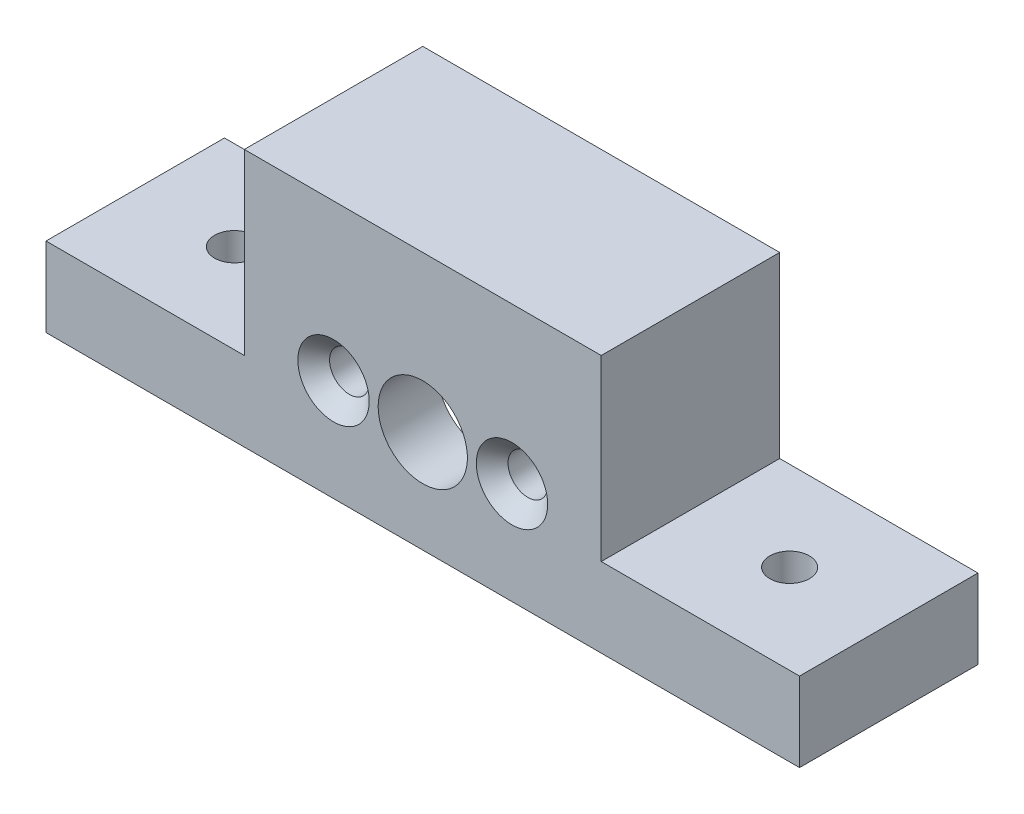
ISO-10303-21;
HEADER;
FILE_DESCRIPTION(('STEP AP214'),'2;1');
FILE_NAME('part.step','',(''),(''),'','','');
FILE_SCHEMA(('AUTOMOTIVE_DESIGN { 1 0 10303 214 1 1 1 1 }'));
ENDSEC;
DATA;
#1=APPLICATION_CONTEXT('core data for automotive mechanical design processes');
#2=APPLICATION_PROTOCOL_DEFINITION('international standard','automotive_design',2000,#1);
#3=PRODUCT_CONTEXT('',#1,'mechanical');
#4=PRODUCT('Part','Part','',(#3));
#5=PRODUCT_RELATED_PRODUCT_CATEGORY('part','',(#4));
#6=PRODUCT_DEFINITION_FORMATION('','',#4);
#7=PRODUCT_DEFINITION_CONTEXT('part definition',#1,'design');
#8=PRODUCT_DEFINITION('design','',#6,#7);
#9=PRODUCT_DEFINITION_SHAPE('','',#8);
#10=(LENGTH_UNIT() NAMED_UNIT(*) SI_UNIT(.MILLI.,.METRE.));
#11=(NAMED_UNIT(*) PLANE_ANGLE_UNIT() SI_UNIT($,.RADIAN.));
#12=(NAMED_UNIT(*) SI_UNIT($,.STERADIAN.) SOLID_ANGLE_UNIT());
#13=UNCERTAINTY_MEASURE_WITH_UNIT(LENGTH_MEASURE(1.E-05),#10,'distance_accuracy_value','');
#14=(GEOMETRIC_REPRESENTATION_CONTEXT(3) GLOBAL_UNCERTAINTY_ASSIGNED_CONTEXT((#13)) GLOBAL_UNIT_ASSIGNED_CONTEXT((#10,
#11,#12)) REPRESENTATION_CONTEXT('',''));
#15=CARTESIAN_POINT('',(0.,0.,0.));
#16=DIRECTION('',(0.,0.,1.));
#17=DIRECTION('',(1.,0.,0.));
#18=AXIS2_PLACEMENT_3D('',#15,#16,#17);
#19=CARTESIAN_POINT('',(9.,-6.5,9.));
#20=DIRECTION('',(-1.,0.,0.));
#21=DIRECTION('',(0.,0.,1.));
#22=AXIS2_PLACEMENT_3D('',#19,#20,#21);
#23=PLANE('',#22);
#24=DIRECTION('',(0.,0.,1.));
#25=VECTOR('',#24,1.);
#26=CARTESIAN_POINT('',(9.,-2.5,9.));
#27=LINE('',#26,#25);
#28=CARTESIAN_POINT('',(9.,-2.5,0.));
#29=VERTEX_POINT('',#28);
#30=CARTESIAN_POINT('',(9.,-2.5,9.));
#31=VERTEX_POINT('',#30);
#32=EDGE_CURVE('E62',#29,#31,#27,.T.);
#33=ORIENTED_EDGE('',*,*,#32,.F.);
#34=DIRECTION('',(0.,1.,0.));
#35=VECTOR('',#34,1.);
#36=CARTESIAN_POINT('',(9.,-6.5,0.));
#37=LINE('',#36,#35);
#38=CARTESIAN_POINT('',(9.,6.5,0.));
#39=VERTEX_POINT('',#38);
#40=EDGE_CURVE('E191',#29,#39,#37,.T.);
#41=ORIENTED_EDGE('',*,*,#40,.T.);
#42=DIRECTION('',(0.,0.,-1.));
#43=VECTOR('',#42,1.);
#44=CARTESIAN_POINT('',(9.,6.5,9.));
#45=LINE('',#44,#43);
#46=CARTESIAN_POINT('',(9.,6.5,9.));
#47=VERTEX_POINT('',#46);
#48=EDGE_CURVE('E11',#47,#39,#45,.T.);
#49=ORIENTED_EDGE('',*,*,#48,.F.);
#50=DIRECTION('',(0.,1.,0.));
#51=VECTOR('',#50,1.);
#52=CARTESIAN_POINT('',(9.,-6.5,9.));
#53=LINE('',#52,#51);
#54=EDGE_CURVE('E201',#31,#47,#53,.T.);
#55=ORIENTED_EDGE('',*,*,#54,.F.);
#56=EDGE_LOOP('',(#33,#41,#49,#55));
#57=FACE_BOUND('',#56,.T.);
#58=ADVANCED_FACE('F37',(#57),#23,.F.);
#59=CARTESIAN_POINT('',(-9.,-6.5,9.));
#60=DIRECTION('',(1.,0.,0.));
#61=DIRECTION('',(0.,0.,-1.));
#62=AXIS2_PLACEMENT_3D('',#59,#60,#61);
#63=PLANE('',#62);
#64=DIRECTION('',(0.,-1.,0.));
#65=VECTOR('',#64,1.);
#66=CARTESIAN_POINT('',(-9.,-6.5,0.));
#67=LINE('',#66,#65);
#68=CARTESIAN_POINT('',(-9.,6.5,0.));
#69=VERTEX_POINT('',#68);
#70=CARTESIAN_POINT('',(-9.,-2.5,0.));
#71=VERTEX_POINT('',#70);
#72=EDGE_CURVE('E171',#69,#71,#67,.T.);
#73=ORIENTED_EDGE('',*,*,#72,.T.);
#74=DIRECTION('',(0.,0.,1.));
#75=VECTOR('',#74,1.);
#76=CARTESIAN_POINT('',(-9.,-2.5,9.));
#77=LINE('',#76,#75);
#78=CARTESIAN_POINT('',(-9.,-2.5,9.));
#79=VERTEX_POINT('',#78);
#80=EDGE_CURVE('E146',#71,#79,#77,.T.);
#81=ORIENTED_EDGE('',*,*,#80,.T.);
#82=DIRECTION('',(0.,-1.,0.));
#83=VECTOR('',#82,1.);
#84=CARTESIAN_POINT('',(-9.,-6.5,9.));
#85=LINE('',#84,#83);
#86=CARTESIAN_POINT('',(-9.,6.5,9.));
#87=VERTEX_POINT('',#86);
#88=EDGE_CURVE('E134',#87,#79,#85,.T.);
#89=ORIENTED_EDGE('',*,*,#88,.F.);
#90=DIRECTION('',(0.,0.,-1.));
#91=VECTOR('',#90,1.);
#92=CARTESIAN_POINT('',(-9.,6.5,9.));
#93=LINE('',#92,#91);
#94=EDGE_CURVE('E46',#87,#69,#93,.T.);
#95=ORIENTED_EDGE('',*,*,#94,.T.);
#96=EDGE_LOOP('',(#73,#81,#89,#95));
#97=FACE_BOUND('',#96,.T.);
#98=ADVANCED_FACE('F39',(#97),#63,.F.);
#99=CARTESIAN_POINT('',(9.,-6.5,9.));
#100=DIRECTION('',(0.,1.,0.));
#101=DIRECTION('',(-1.,0.,0.));
#102=AXIS2_PLACEMENT_3D('',#99,#100,#101);
#103=PLANE('',#102);
#104=CARTESIAN_POINT('',(-14.,-6.5,4.5));
#105=DIRECTION('',(0.,1.,0.));
#106=DIRECTION('',(0.,0.,1.));
#107=AXIS2_PLACEMENT_3D('',#104,#105,#106);
#108=CIRCLE('',#107,0.999999999999999);
#109=CARTESIAN_POINT('',(-14.,-6.5,5.5));
#110=VERTEX_POINT('',#109);
#111=EDGE_CURVE('E160',#110,#110,#108,.T.);
#112=ORIENTED_EDGE('',*,*,#111,.T.);
#113=EDGE_LOOP('',(#112));
#114=FACE_BOUND('',#113,.T.);
#115=CARTESIAN_POINT('',(14.,-6.5,4.5));
#116=DIRECTION('',(0.,1.,0.));
#117=DIRECTION('',(0.,0.,1.));
#118=AXIS2_PLACEMENT_3D('',#115,#116,#117);
#119=CIRCLE('',#118,0.999999999999999);
#120=CARTESIAN_POINT('',(14.,-6.5,5.5));
#121=VERTEX_POINT('',#120);
#122=EDGE_CURVE('E267',#121,#121,#119,.T.);
#123=ORIENTED_EDGE('',*,*,#122,.T.);
#124=EDGE_LOOP('',(#123));
#125=FACE_BOUND('',#124,.T.);
#126=DIRECTION('',(-1.,0.,0.));
#127=VECTOR('',#126,1.);
#128=CARTESIAN_POINT('',(6.3,-6.5,6.));
#129=LINE('',#128,#127);
#130=CARTESIAN_POINT('',(6.3,-6.5,6.));
#131=VERTEX_POINT('',#130);
#132=CARTESIAN_POINT('',(-6.3,-6.5,6.));
#133=VERTEX_POINT('',#132);
#134=EDGE_CURVE('E232',#131,#133,#129,.T.);
#135=ORIENTED_EDGE('',*,*,#134,.F.);
#136=DIRECTION('',(0.,0.,-1.));
#137=VECTOR('',#136,1.);
#138=CARTESIAN_POINT('',(6.3,-6.5,6.));
#139=LINE('',#138,#137);
#140=CARTESIAN_POINT('',(6.3,-6.5,0.));
#141=VERTEX_POINT('',#140);
#142=EDGE_CURVE('E210',#131,#141,#139,.T.);
#143=ORIENTED_EDGE('',*,*,#142,.T.);
#144=DIRECTION('',(1.,0.,0.));
#145=VECTOR('',#144,1.);
#146=CARTESIAN_POINT('',(9.,-6.5,0.));
#147=LINE('',#146,#145);
#148=CARTESIAN_POINT('',(19.,-6.5,0.));
#149=VERTEX_POINT('',#148);
#150=EDGE_CURVE('E175',#141,#149,#147,.T.);
#151=ORIENTED_EDGE('',*,*,#150,.T.);
#152=DIRECTION('',(0.,0.,-1.));
#153=VECTOR('',#152,1.);
#154=CARTESIAN_POINT('',(19.,-6.5,9.));
#155=LINE('',#154,#153);
#156=CARTESIAN_POINT('',(19.,-6.5,9.));
#157=VERTEX_POINT('',#156);
#158=EDGE_CURVE('E262',#157,#149,#155,.T.);
#159=ORIENTED_EDGE('',*,*,#158,.F.);
#160=DIRECTION('',(1.,0.,0.));
#161=VECTOR('',#160,1.);
#162=CARTESIAN_POINT('',(9.,-6.5,9.));
#163=LINE('',#162,#161);
#164=CARTESIAN_POINT('',(-19.,-6.5,9.));
#165=VERTEX_POINT('',#164);
#166=EDGE_CURVE('E203',#165,#157,#163,.T.);
#167=ORIENTED_EDGE('',*,*,#166,.F.);
#168=DIRECTION('',(0.,0.,-1.));
#169=VECTOR('',#168,1.);
#170=CARTESIAN_POINT('',(-19.,-6.5,9.));
#171=LINE('',#170,#169);
#172=CARTESIAN_POINT('',(-19.,-6.5,0.));
#173=VERTEX_POINT('',#172);
#174=EDGE_CURVE('E145',#165,#173,#171,.T.);
#175=ORIENTED_EDGE('',*,*,#174,.T.);
#176=CARTESIAN_POINT('',(-6.3,-6.5,0.));
#177=VERTEX_POINT('',#176);
#178=EDGE_CURVE('E177',#173,#177,#147,.T.);
#179=ORIENTED_EDGE('',*,*,#178,.T.);
#180=DIRECTION('',(0.,0.,-1.));
#181=VECTOR('',#180,1.);
#182=CARTESIAN_POINT('',(-6.3,-6.5,6.));
#183=LINE('',#182,#181);
#184=EDGE_CURVE('E213',#133,#177,#183,.T.);
#185=ORIENTED_EDGE('',*,*,#184,.F.);
#186=EDGE_LOOP('',(#135,#143,#151,#159,#167,#175,#179,#185));
#187=FACE_BOUND('',#186,.T.);
#188=ADVANCED_FACE('F325',(#114,#125,#187),#103,.F.);
#189=CARTESIAN_POINT('',(9.,6.5,9.));
#190=DIRECTION('',(0.,-1.,0.));
#191=DIRECTION('',(1.,0.,0.));
#192=AXIS2_PLACEMENT_3D('',#189,#190,#191);
#193=PLANE('',#192);
#194=DIRECTION('',(-1.,0.,0.));
#195=VECTOR('',#194,1.);
#196=CARTESIAN_POINT('',(9.,6.5,0.));
#197=LINE('',#196,#195);
#198=EDGE_CURVE('E194',#39,#69,#197,.T.);
#199=ORIENTED_EDGE('',*,*,#198,.T.);
#200=ORIENTED_EDGE('',*,*,#94,.F.);
#201=DIRECTION('',(-1.,0.,0.));
#202=VECTOR('',#201,1.);
#203=CARTESIAN_POINT('',(9.,6.5,9.));
#204=LINE('',#203,#202);
#205=EDGE_CURVE('E187',#47,#87,#204,.T.);
#206=ORIENTED_EDGE('',*,*,#205,.F.);
#207=ORIENTED_EDGE('',*,*,#48,.T.);
#208=EDGE_LOOP('',(#199,#200,#206,#207));
#209=FACE_BOUND('',#208,.T.);
#210=ADVANCED_FACE('F296',(#209),#193,.F.);
#211=CARTESIAN_POINT('',(0.,0.,9.));
#212=DIRECTION('',(0.,0.,1.));
#213=DIRECTION('',(1.,0.,0.));
#214=AXIS2_PLACEMENT_3D('',#211,#212,#213);
#215=PLANE('',#214);
#216=CARTESIAN_POINT('',(-4.5,-1.35,9.));
#217=DIRECTION('',(0.,0.,1.));
#218=DIRECTION('',(1.,0.,0.));
#219=AXIS2_PLACEMENT_3D('',#216,#217,#218);
#220=CIRCLE('',#219,1.8);
#221=CARTESIAN_POINT('',(-2.7,-1.35,9.));
#222=VERTEX_POINT('',#221);
#223=EDGE_CURVE('E252',#222,#222,#220,.T.);
#224=ORIENTED_EDGE('',*,*,#223,.F.);
#225=EDGE_LOOP('',(#224));
#226=FACE_BOUND('',#225,.T.);
#227=CARTESIAN_POINT('',(4.5,-1.35,9.));
#228=DIRECTION('',(0.,0.,1.));
#229=DIRECTION('',(1.,0.,0.));
#230=AXIS2_PLACEMENT_3D('',#227,#228,#229);
#231=CIRCLE('',#230,1.8);
#232=CARTESIAN_POINT('',(6.3,-1.35,9.));
#233=VERTEX_POINT('',#232);
#234=EDGE_CURVE('E246',#233,#233,#231,.T.);
#235=ORIENTED_EDGE('',*,*,#234,.F.);
#236=EDGE_LOOP('',(#235));
#237=FACE_BOUND('',#236,.T.);
#238=CARTESIAN_POINT('',(0.,-1.35,9.));
#239=DIRECTION('',(0.,0.,-1.));
#240=DIRECTION('',(-1.,0.,0.));
#241=AXIS2_PLACEMENT_3D('',#238,#239,#240);
#242=CIRCLE('',#241,2.25);
#243=CARTESIAN_POINT('',(-2.25,-1.35,9.));
#244=VERTEX_POINT('',#243);
#245=EDGE_CURVE('E226',#244,#244,#242,.T.);
#246=ORIENTED_EDGE('',*,*,#245,.T.);
#247=EDGE_LOOP('',(#246));
#248=FACE_BOUND('',#247,.T.);
#249=ORIENTED_EDGE('',*,*,#88,.T.);
#250=DIRECTION('',(1.,0.,0.));
#251=VECTOR('',#250,1.);
#252=CARTESIAN_POINT('',(-19.,-2.5,9.));
#253=LINE('',#252,#251);
#254=CARTESIAN_POINT('',(-19.,-2.5,9.));
#255=VERTEX_POINT('',#254);
#256=EDGE_CURVE('E54',#255,#79,#253,.T.);
#257=ORIENTED_EDGE('',*,*,#256,.F.);
#258=DIRECTION('',(0.,-1.,0.));
#259=VECTOR('',#258,1.);
#260=CARTESIAN_POINT('',(-19.,-6.5,9.));
#261=LINE('',#260,#259);
#262=EDGE_CURVE('E131',#255,#165,#261,.T.);
#263=ORIENTED_EDGE('',*,*,#262,.T.);
#264=ORIENTED_EDGE('',*,*,#166,.T.);
#265=DIRECTION('',(0.,-1.,0.));
#266=VECTOR('',#265,1.);
#267=CARTESIAN_POINT('',(19.,-6.5,9.));
#268=LINE('',#267,#266);
#269=CARTESIAN_POINT('',(19.,-2.5,9.));
#270=VERTEX_POINT('',#269);
#271=EDGE_CURVE('E265',#270,#157,#268,.T.);
#272=ORIENTED_EDGE('',*,*,#271,.F.);
#273=DIRECTION('',(-1.,0.,0.));
#274=VECTOR('',#273,1.);
#275=CARTESIAN_POINT('',(19.,-2.5,9.));
#276=LINE('',#275,#274);
#277=EDGE_CURVE('E259',#270,#31,#276,.T.);
#278=ORIENTED_EDGE('',*,*,#277,.T.);
#279=ORIENTED_EDGE('',*,*,#54,.T.);
#280=ORIENTED_EDGE('',*,*,#205,.T.);
#281=EDGE_LOOP('',(#249,#257,#263,#264,#272,#278,#279,#280));
#282=FACE_BOUND('',#281,.T.);
#283=ADVANCED_FACE('F130',(#226,#237,#248,#282),#215,.T.);
#284=CARTESIAN_POINT('',(0.,0.,0.));
#285=DIRECTION('',(0.,0.,1.));
#286=DIRECTION('',(1.,0.,0.));
#287=AXIS2_PLACEMENT_3D('',#284,#285,#286);
#288=PLANE('',#287);
#289=ORIENTED_EDGE('',*,*,#150,.F.);
#290=DIRECTION('',(0.,-1.,0.));
#291=VECTOR('',#290,1.);
#292=CARTESIAN_POINT('',(6.3,-6.5,0.));
#293=LINE('',#292,#291);
#294=CARTESIAN_POINT('',(6.3,3.8,0.));
#295=VERTEX_POINT('',#294);
#296=EDGE_CURVE('E224',#295,#141,#293,.T.);
#297=ORIENTED_EDGE('',*,*,#296,.F.);
#298=DIRECTION('',(1.,0.,0.));
#299=VECTOR('',#298,1.);
#300=CARTESIAN_POINT('',(6.3,3.8,0.));
#301=LINE('',#300,#299);
#302=CARTESIAN_POINT('',(-6.3,3.8,0.));
#303=VERTEX_POINT('',#302);
#304=EDGE_CURVE('E217',#303,#295,#301,.T.);
#305=ORIENTED_EDGE('',*,*,#304,.F.);
#306=DIRECTION('',(0.,1.,0.));
#307=VECTOR('',#306,1.);
#308=CARTESIAN_POINT('',(-6.3,-6.5,0.));
#309=LINE('',#308,#307);
#310=EDGE_CURVE('E221',#177,#303,#309,.T.);
#311=ORIENTED_EDGE('',*,*,#310,.F.);
#312=ORIENTED_EDGE('',*,*,#178,.F.);
#313=DIRECTION('',(0.,1.,0.));
#314=VECTOR('',#313,1.);
#315=CARTESIAN_POINT('',(-19.,-6.5,0.));
#316=LINE('',#315,#314);
#317=CARTESIAN_POINT('',(-19.,-2.5,0.));
#318=VERTEX_POINT('',#317);
#319=EDGE_CURVE('E149',#173,#318,#316,.T.);
#320=ORIENTED_EDGE('',*,*,#319,.T.);
#321=DIRECTION('',(1.,0.,0.));
#322=VECTOR('',#321,1.);
#323=CARTESIAN_POINT('',(-19.,-2.5,0.));
#324=LINE('',#323,#322);
#325=EDGE_CURVE('E136',#318,#71,#324,.T.);
#326=ORIENTED_EDGE('',*,*,#325,.T.);
#327=ORIENTED_EDGE('',*,*,#72,.F.);
#328=ORIENTED_EDGE('',*,*,#198,.F.);
#329=ORIENTED_EDGE('',*,*,#40,.F.);
#330=DIRECTION('',(-1.,0.,0.));
#331=VECTOR('',#330,1.);
#332=CARTESIAN_POINT('',(19.,-2.5,0.));
#333=LINE('',#332,#331);
#334=CARTESIAN_POINT('',(19.,-2.5,0.));
#335=VERTEX_POINT('',#334);
#336=EDGE_CURVE('E254',#335,#29,#333,.T.);
#337=ORIENTED_EDGE('',*,*,#336,.F.);
#338=DIRECTION('',(0.,1.,0.));
#339=VECTOR('',#338,1.);
#340=CARTESIAN_POINT('',(19.,-6.5,0.));
#341=LINE('',#340,#339);
#342=EDGE_CURVE('E260',#149,#335,#341,.T.);
#343=ORIENTED_EDGE('',*,*,#342,.F.);
#344=EDGE_LOOP('',(#289,#297,#305,#311,#312,#320,#326,#327,#328,#329,#337,#343));
#345=FACE_BOUND('',#344,.T.);
#346=ADVANCED_FACE('F168',(#345),#288,.F.);
#347=CARTESIAN_POINT('',(6.3,-6.5,6.));
#348=DIRECTION('',(1.,0.,0.));
#349=DIRECTION('',(0.,0.,-1.));
#350=AXIS2_PLACEMENT_3D('',#347,#348,#349);
#351=PLANE('',#350);
#352=ORIENTED_EDGE('',*,*,#296,.T.);
#353=ORIENTED_EDGE('',*,*,#142,.F.);
#354=DIRECTION('',(0.,-1.,0.));
#355=VECTOR('',#354,1.);
#356=CARTESIAN_POINT('',(6.3,-6.5,6.));
#357=LINE('',#356,#355);
#358=CARTESIAN_POINT('',(6.3,3.8,6.));
#359=VERTEX_POINT('',#358);
#360=EDGE_CURVE('E220',#359,#131,#357,.T.);
#361=ORIENTED_EDGE('',*,*,#360,.F.);
#362=DIRECTION('',(0.,0.,-1.));
#363=VECTOR('',#362,1.);
#364=CARTESIAN_POINT('',(6.3,3.8,6.));
#365=LINE('',#364,#363);
#366=EDGE_CURVE('E176',#359,#295,#365,.T.);
#367=ORIENTED_EDGE('',*,*,#366,.T.);
#368=EDGE_LOOP('',(#352,#353,#361,#367));
#369=FACE_BOUND('',#368,.T.);
#370=ADVANCED_FACE('F344',(#369),#351,.F.);
#371=CARTESIAN_POINT('',(6.3,3.8,6.));
#372=DIRECTION('',(0.,1.,0.));
#373=DIRECTION('',(0.,0.,1.));
#374=AXIS2_PLACEMENT_3D('',#371,#372,#373);
#375=PLANE('',#374);
#376=ORIENTED_EDGE('',*,*,#304,.T.);
#377=ORIENTED_EDGE('',*,*,#366,.F.);
#378=DIRECTION('',(1.,0.,0.));
#379=VECTOR('',#378,1.);
#380=CARTESIAN_POINT('',(6.3,3.8,6.));
#381=LINE('',#380,#379);
#382=CARTESIAN_POINT('',(-6.3,3.8,6.));
#383=VERTEX_POINT('',#382);
#384=EDGE_CURVE('E214',#383,#359,#381,.T.);
#385=ORIENTED_EDGE('',*,*,#384,.F.);
#386=DIRECTION('',(0.,0.,-1.));
#387=VECTOR('',#386,1.);
#388=CARTESIAN_POINT('',(-6.3,3.8,6.));
#389=LINE('',#388,#387);
#390=EDGE_CURVE('E179',#383,#303,#389,.T.);
#391=ORIENTED_EDGE('',*,*,#390,.T.);
#392=EDGE_LOOP('',(#376,#377,#385,#391));
#393=FACE_BOUND('',#392,.T.);
#394=ADVANCED_FACE('F351',(#393),#375,.F.);
#395=CARTESIAN_POINT('',(-6.3,-6.5,6.));
#396=DIRECTION('',(-1.,0.,0.));
#397=DIRECTION('',(0.,0.,1.));
#398=AXIS2_PLACEMENT_3D('',#395,#396,#397);
#399=PLANE('',#398);
#400=ORIENTED_EDGE('',*,*,#310,.T.);
#401=ORIENTED_EDGE('',*,*,#390,.F.);
#402=DIRECTION('',(0.,1.,0.));
#403=VECTOR('',#402,1.);
#404=CARTESIAN_POINT('',(-6.3,-6.5,6.));
#405=LINE('',#404,#403);
#406=EDGE_CURVE('E229',#133,#383,#405,.T.);
#407=ORIENTED_EDGE('',*,*,#406,.F.);
#408=ORIENTED_EDGE('',*,*,#184,.T.);
#409=EDGE_LOOP('',(#400,#401,#407,#408));
#410=FACE_BOUND('',#409,.T.);
#411=ADVANCED_FACE('F349',(#410),#399,.F.);
#412=CARTESIAN_POINT('',(0.,0.,6.));
#413=DIRECTION('',(0.,0.,1.));
#414=DIRECTION('',(1.,0.,0.));
#415=AXIS2_PLACEMENT_3D('',#412,#413,#414);
#416=PLANE('',#415);
#417=CARTESIAN_POINT('',(-4.5,-1.35,6.));
#418=DIRECTION('',(0.,0.,1.));
#419=DIRECTION('',(1.,0.,0.));
#420=AXIS2_PLACEMENT_3D('',#417,#418,#419);
#421=CIRCLE('',#420,0.999999999999992);
#422=CARTESIAN_POINT('',(-3.50000000000001,-1.35,6.));
#423=VERTEX_POINT('',#422);
#424=EDGE_CURVE('E199',#423,#423,#421,.T.);
#425=ORIENTED_EDGE('',*,*,#424,.T.);
#426=EDGE_LOOP('',(#425));
#427=FACE_BOUND('',#426,.T.);
#428=CARTESIAN_POINT('',(4.5,-1.35,6.));
#429=DIRECTION('',(0.,0.,1.));
#430=DIRECTION('',(1.,0.,0.));
#431=AXIS2_PLACEMENT_3D('',#428,#429,#430);
#432=CIRCLE('',#431,0.999999999999992);
#433=CARTESIAN_POINT('',(5.49999999999999,-1.35,6.));
#434=VERTEX_POINT('',#433);
#435=EDGE_CURVE('E240',#434,#434,#432,.T.);
#436=ORIENTED_EDGE('',*,*,#435,.T.);
#437=EDGE_LOOP('',(#436));
#438=FACE_BOUND('',#437,.T.);
#439=CARTESIAN_POINT('',(0.,-1.35,6.));
#440=DIRECTION('',(0.,0.,-1.));
#441=DIRECTION('',(-1.,0.,0.));
#442=AXIS2_PLACEMENT_3D('',#439,#440,#441);
#443=CIRCLE('',#442,2.25);
#444=CARTESIAN_POINT('',(-2.25,-1.35,6.));
#445=VERTEX_POINT('',#444);
#446=EDGE_CURVE('E237',#445,#445,#443,.T.);
#447=ORIENTED_EDGE('',*,*,#446,.F.);
#448=EDGE_LOOP('',(#447));
#449=FACE_BOUND('',#448,.T.);
#450=ORIENTED_EDGE('',*,*,#360,.T.);
#451=ORIENTED_EDGE('',*,*,#134,.T.);
#452=ORIENTED_EDGE('',*,*,#406,.T.);
#453=ORIENTED_EDGE('',*,*,#384,.T.);
#454=EDGE_LOOP('',(#450,#451,#452,#453));
#455=FACE_BOUND('',#454,.T.);
#456=ADVANCED_FACE('F300',(#427,#438,#449,#455),#416,.F.);
#457=CARTESIAN_POINT('',(0.,-1.35,9.));
#458=DIRECTION('',(0.,0.,-1.));
#459=DIRECTION('',(-1.,0.,0.));
#460=AXIS2_PLACEMENT_3D('',#457,#458,#459);
#461=CYLINDRICAL_SURFACE('',#460,2.25);
#462=ORIENTED_EDGE('',*,*,#245,.F.);
#463=EDGE_LOOP('',(#462));
#464=FACE_BOUND('',#463,.T.);
#465=ORIENTED_EDGE('',*,*,#446,.T.);
#466=EDGE_LOOP('',(#465));
#467=FACE_BOUND('',#466,.T.);
#468=ADVANCED_FACE('F306',(#464,#467),#461,.F.);
#469=CARTESIAN_POINT('',(4.5,-1.35,9.));
#470=DIRECTION('',(0.,0.,1.));
#471=DIRECTION('',(1.,0.,0.));
#472=AXIS2_PLACEMENT_3D('',#469,#470,#471);
#473=CYLINDRICAL_SURFACE('',#472,0.999999999999992);
#474=CARTESIAN_POINT('',(4.5,-1.35,8.19999999999999));
#475=DIRECTION('',(0.,0.,1.));
#476=DIRECTION('',(1.,0.,0.));
#477=AXIS2_PLACEMENT_3D('',#474,#475,#476);
#478=CIRCLE('',#477,0.999999999999987);
#479=CARTESIAN_POINT('',(5.49999999999999,-1.35,8.19999999999999));
#480=VERTEX_POINT('',#479);
#481=EDGE_CURVE('E243',#480,#480,#478,.T.);
#482=ORIENTED_EDGE('',*,*,#481,.T.);
#483=EDGE_LOOP('',(#482));
#484=FACE_BOUND('',#483,.T.);
#485=ORIENTED_EDGE('',*,*,#435,.F.);
#486=EDGE_LOOP('',(#485));
#487=FACE_BOUND('',#486,.T.);
#488=ADVANCED_FACE('F303',(#484,#487),#473,.F.);
#489=CARTESIAN_POINT('',(4.5,-1.35,9.));
#490=DIRECTION('',(0.,0.,1.));
#491=DIRECTION('',(1.,0.,0.));
#492=AXIS2_PLACEMENT_3D('',#489,#490,#491);
#493=CONICAL_SURFACE('',#492,1.8,0.785398163397449);
#494=ORIENTED_EDGE('',*,*,#481,.F.);
#495=EDGE_LOOP('',(#494));
#496=FACE_BOUND('',#495,.T.);
#497=ORIENTED_EDGE('',*,*,#234,.T.);
#498=EDGE_LOOP('',(#497));
#499=FACE_BOUND('',#498,.T.);
#500=ADVANCED_FACE('F305',(#496,#499),#493,.F.);
#501=CARTESIAN_POINT('',(-4.5,-1.35,9.));
#502=DIRECTION('',(0.,0.,1.));
#503=DIRECTION('',(1.,0.,0.));
#504=AXIS2_PLACEMENT_3D('',#501,#502,#503);
#505=CYLINDRICAL_SURFACE('',#504,0.999999999999992);
#506=CARTESIAN_POINT('',(-4.5,-1.35,8.19999999999999));
#507=DIRECTION('',(0.,0.,1.));
#508=DIRECTION('',(1.,0.,0.));
#509=AXIS2_PLACEMENT_3D('',#506,#507,#508);
#510=CIRCLE('',#509,0.999999999999987);
#511=CARTESIAN_POINT('',(-3.50000000000001,-1.35,8.19999999999999));
#512=VERTEX_POINT('',#511);
#513=EDGE_CURVE('E249',#512,#512,#510,.T.);
#514=ORIENTED_EDGE('',*,*,#513,.T.);
#515=EDGE_LOOP('',(#514));
#516=FACE_BOUND('',#515,.T.);
#517=ORIENTED_EDGE('',*,*,#424,.F.);
#518=EDGE_LOOP('',(#517));
#519=FACE_BOUND('',#518,.T.);
#520=ADVANCED_FACE('F313',(#516,#519),#505,.F.);
#521=CARTESIAN_POINT('',(-4.5,-1.35,9.));
#522=DIRECTION('',(0.,0.,1.));
#523=DIRECTION('',(1.,0.,0.));
#524=AXIS2_PLACEMENT_3D('',#521,#522,#523);
#525=CONICAL_SURFACE('',#524,1.8,0.785398163397449);
#526=ORIENTED_EDGE('',*,*,#513,.F.);
#527=EDGE_LOOP('',(#526));
#528=FACE_BOUND('',#527,.T.);
#529=ORIENTED_EDGE('',*,*,#223,.T.);
#530=EDGE_LOOP('',(#529));
#531=FACE_BOUND('',#530,.T.);
#532=ADVANCED_FACE('F280',(#528,#531),#525,.F.);
#533=CARTESIAN_POINT('',(19.,-2.5,9.));
#534=DIRECTION('',(0.,-1.,0.));
#535=DIRECTION('',(0.,0.,-1.));
#536=AXIS2_PLACEMENT_3D('',#533,#534,#535);
#537=PLANE('',#536);
#538=CARTESIAN_POINT('',(14.,-2.5,4.5));
#539=DIRECTION('',(0.,1.,0.));
#540=DIRECTION('',(0.,0.,1.));
#541=AXIS2_PLACEMENT_3D('',#538,#539,#540);
#542=CIRCLE('',#541,0.999999999999987);
#543=CARTESIAN_POINT('',(14.,-2.5,5.49999999999999));
#544=VERTEX_POINT('',#543);
#545=EDGE_CURVE('E135',#544,#544,#542,.T.);
#546=ORIENTED_EDGE('',*,*,#545,.F.);
#547=EDGE_LOOP('',(#546));
#548=FACE_BOUND('',#547,.T.);
#549=ORIENTED_EDGE('',*,*,#32,.T.);
#550=ORIENTED_EDGE('',*,*,#277,.F.);
#551=DIRECTION('',(0.,0.,1.));
#552=VECTOR('',#551,1.);
#553=CARTESIAN_POINT('',(19.,-2.5,9.));
#554=LINE('',#553,#552);
#555=EDGE_CURVE('E257',#335,#270,#554,.T.);
#556=ORIENTED_EDGE('',*,*,#555,.F.);
#557=ORIENTED_EDGE('',*,*,#336,.T.);
#558=EDGE_LOOP('',(#549,#550,#556,#557));
#559=FACE_BOUND('',#558,.T.);
#560=ADVANCED_FACE('F276',(#548,#559),#537,.F.);
#561=CARTESIAN_POINT('',(19.,0.,0.));
#562=DIRECTION('',(-1.,0.,0.));
#563=DIRECTION('',(0.,0.,1.));
#564=AXIS2_PLACEMENT_3D('',#561,#562,#563);
#565=PLANE('',#564);
#566=ORIENTED_EDGE('',*,*,#271,.T.);
#567=ORIENTED_EDGE('',*,*,#158,.T.);
#568=ORIENTED_EDGE('',*,*,#342,.T.);
#569=ORIENTED_EDGE('',*,*,#555,.T.);
#570=EDGE_LOOP('',(#566,#567,#568,#569));
#571=FACE_BOUND('',#570,.T.);
#572=ADVANCED_FACE('F279',(#571),#565,.F.);
#573=CARTESIAN_POINT('',(14.,-2.5,4.5));
#574=DIRECTION('',(0.,1.,0.));
#575=DIRECTION('',(0.,0.,1.));
#576=AXIS2_PLACEMENT_3D('',#573,#574,#575);
#577=CYLINDRICAL_SURFACE('',#576,0.999999999999993);
#578=ORIENTED_EDGE('',*,*,#122,.F.);
#579=EDGE_LOOP('',(#578));
#580=FACE_BOUND('',#579,.T.);
#581=ORIENTED_EDGE('',*,*,#545,.T.);
#582=EDGE_LOOP('',(#581));
#583=FACE_BOUND('',#582,.T.);
#584=ADVANCED_FACE('F274',(#580,#583),#577,.F.);
#585=CARTESIAN_POINT('',(-19.,-2.5,9.));
#586=DIRECTION('',(0.,1.,0.));
#587=DIRECTION('',(0.,0.,1.));
#588=AXIS2_PLACEMENT_3D('',#585,#586,#587);
#589=PLANE('',#588);
#590=CARTESIAN_POINT('',(-14.,-2.5,4.5));
#591=DIRECTION('',(0.,1.,0.));
#592=DIRECTION('',(0.,0.,1.));
#593=AXIS2_PLACEMENT_3D('',#590,#591,#592);
#594=CIRCLE('',#593,0.999999999999987);
#595=CARTESIAN_POINT('',(-14.,-2.5,5.49999999999999));
#596=VERTEX_POINT('',#595);
#597=EDGE_CURVE('E535',#596,#596,#594,.T.);
#598=ORIENTED_EDGE('',*,*,#597,.F.);
#599=EDGE_LOOP('',(#598));
#600=FACE_BOUND('',#599,.T.);
#601=ORIENTED_EDGE('',*,*,#80,.F.);
#602=ORIENTED_EDGE('',*,*,#325,.F.);
#603=DIRECTION('',(0.,0.,1.));
#604=VECTOR('',#603,1.);
#605=CARTESIAN_POINT('',(-19.,-2.5,9.));
#606=LINE('',#605,#604);
#607=EDGE_CURVE('E142',#318,#255,#606,.T.);
#608=ORIENTED_EDGE('',*,*,#607,.T.);
#609=ORIENTED_EDGE('',*,*,#256,.T.);
#610=EDGE_LOOP('',(#601,#602,#608,#609));
#611=FACE_BOUND('',#610,.T.);
#612=ADVANCED_FACE('F148',(#600,#611),#589,.T.);
#613=CARTESIAN_POINT('',(-19.,0.,0.));
#614=DIRECTION('',(1.,0.,0.));
#615=DIRECTION('',(0.,0.,1.));
#616=AXIS2_PLACEMENT_3D('',#613,#614,#615);
#617=PLANE('',#616);
#618=ORIENTED_EDGE('',*,*,#262,.F.);
#619=ORIENTED_EDGE('',*,*,#607,.F.);
#620=ORIENTED_EDGE('',*,*,#319,.F.);
#621=ORIENTED_EDGE('',*,*,#174,.F.);
#622=EDGE_LOOP('',(#618,#619,#620,#621));
#623=FACE_BOUND('',#622,.T.);
#624=ADVANCED_FACE('F140',(#623),#617,.F.);
#625=CARTESIAN_POINT('',(-14.,-2.5,4.5));
#626=DIRECTION('',(0.,1.,0.));
#627=DIRECTION('',(0.,0.,1.));
#628=AXIS2_PLACEMENT_3D('',#625,#626,#627);
#629=CYLINDRICAL_SURFACE('',#628,0.999999999999993);
#630=ORIENTED_EDGE('',*,*,#111,.F.);
#631=EDGE_LOOP('',(#630));
#632=FACE_BOUND('',#631,.T.);
#633=ORIENTED_EDGE('',*,*,#597,.T.);
#634=EDGE_LOOP('',(#633));
#635=FACE_BOUND('',#634,.T.);
#636=ADVANCED_FACE('F397',(#632,#635),#629,.F.);
#637=CLOSED_SHELL('',(#58,#98,#188,#210,#283,#346,#370,#394,#411,#456,#468,#488,#500,#520,#532,
#560,#572,#584,#612,#624,#636));
#638=MANIFOLD_SOLID_BREP('B2',#637);
#639=ADVANCED_BREP_SHAPE_REPRESENTATION('',(#18,#638),#14);
#640=SHAPE_DEFINITION_REPRESENTATION(#9,#639);
ENDSEC;
END-ISO-10303-21;
